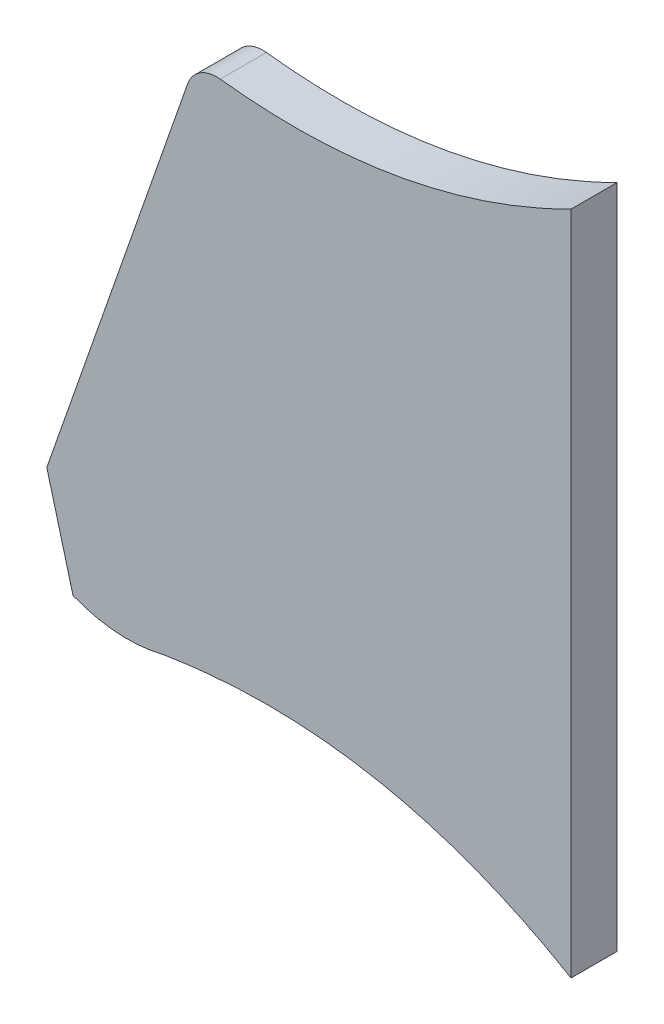
ISO-10303-21;
HEADER;
FILE_DESCRIPTION(('STEP AP214'),'2;1');
FILE_NAME('part.step','',(''),(''),'','','');
FILE_SCHEMA(('AUTOMOTIVE_DESIGN { 1 0 10303 214 1 1 1 1 }'));
ENDSEC;
DATA;
#1=APPLICATION_CONTEXT('core data for automotive mechanical design processes');
#2=APPLICATION_PROTOCOL_DEFINITION('international standard','automotive_design',2000,#1);
#3=PRODUCT_CONTEXT('',#1,'mechanical');
#4=PRODUCT('Part','Part','',(#3));
#5=PRODUCT_RELATED_PRODUCT_CATEGORY('part','',(#4));
#6=PRODUCT_DEFINITION_FORMATION('','',#4);
#7=PRODUCT_DEFINITION_CONTEXT('part definition',#1,'design');
#8=PRODUCT_DEFINITION('design','',#6,#7);
#9=PRODUCT_DEFINITION_SHAPE('','',#8);
#10=(LENGTH_UNIT() NAMED_UNIT(*) SI_UNIT(.MILLI.,.METRE.));
#11=(NAMED_UNIT(*) PLANE_ANGLE_UNIT() SI_UNIT($,.RADIAN.));
#12=(NAMED_UNIT(*) SI_UNIT($,.STERADIAN.) SOLID_ANGLE_UNIT());
#13=UNCERTAINTY_MEASURE_WITH_UNIT(LENGTH_MEASURE(1.E-05),#10,'distance_accuracy_value','');
#14=(GEOMETRIC_REPRESENTATION_CONTEXT(3) GLOBAL_UNCERTAINTY_ASSIGNED_CONTEXT((#13)) GLOBAL_UNIT_ASSIGNED_CONTEXT((#10,
#11,#12)) REPRESENTATION_CONTEXT('',''));
#15=CARTESIAN_POINT('',(0.,0.,0.));
#16=DIRECTION('',(0.,0.,1.));
#17=DIRECTION('',(1.,0.,0.));
#18=AXIS2_PLACEMENT_3D('',#15,#16,#17);
#19=CARTESIAN_POINT('',(0.,0.,3.));
#20=DIRECTION('',(0.,0.,-1.));
#21=DIRECTION('',(-1.,0.,0.));
#22=AXIS2_PLACEMENT_3D('',#19,#20,#21);
#23=PLANE('',#22);
#24=CARTESIAN_POINT('',(-5.3931093211258,31.3380293812654,3.));
#25=CARTESIAN_POINT('',(7.39537405343154,29.3584684990729,3.));
#26=CARTESIAN_POINT('',(18.997709920388,35.207268428555,3.));
#27=B_SPLINE_CURVE_WITH_KNOTS('',2,(#24,#25,#26),.UNSPECIFIED.,.F.,.F.,(3,3),(0.,1.),.UNSPECIFIED.);
#28=CARTESIAN_POINT('',(-3.81103339899508,31.1225545810064,3.));
#29=VERTEX_POINT('',#28);
#30=CARTESIAN_POINT('',(18.997709920388,35.207268428555,3.));
#31=VERTEX_POINT('',#30);
#32=EDGE_CURVE('E214',#29,#31,#27,.T.);
#33=ORIENTED_EDGE('',*,*,#32,.F.);
#34=CARTESIAN_POINT('',(-4.0444178633061,29.1362183325786,3.));
#35=DIRECTION('',(0.,0.,-1.));
#36=DIRECTION('',(-1.,0.,0.));
#37=AXIS2_PLACEMENT_3D('',#34,#35,#36);
#38=CIRCLE('',#37,2.);
#39=CARTESIAN_POINT('',(-5.93227328920437,29.7965227251934,3.));
#40=VERTEX_POINT('',#39);
#41=EDGE_CURVE('E78',#29,#40,#38,.F.);
#42=ORIENTED_EDGE('',*,*,#41,.T.);
#43=DIRECTION('',(0.330152196307426,0.943927712949134,0.));
#44=VECTOR('',#43,1.);
#45=CARTESIAN_POINT('',(-5.39310932447679,31.3380293812812,3.));
#46=LINE('',#45,#44);
#47=CARTESIAN_POINT('',(-15.0880835271317,3.61943496159888,3.));
#48=VERTEX_POINT('',#47);
#49=EDGE_CURVE('E114',#48,#40,#46,.T.);
#50=ORIENTED_EDGE('',*,*,#49,.F.);
#51=DIRECTION('',(0.259073903685408,-0.965857501099,0.));
#52=VECTOR('',#51,1.);
#53=CARTESIAN_POINT('',(-15.0880835271317,3.61943496159888,3.));
#54=LINE('',#53,#52);
#55=CARTESIAN_POINT('',(-13.3809594999607,-2.74492101364292,3.));
#56=VERTEX_POINT('',#55);
#57=EDGE_CURVE('E124',#48,#56,#54,.T.);
#58=ORIENTED_EDGE('',*,*,#57,.T.);
#59=CARTESIAN_POINT('',(-13.3809594999607,-2.74492101364292,3.));
#60=CARTESIAN_POINT('',(-10.4890091440922,-3.87702708765904,3.));
#61=CARTESIAN_POINT('',(-7.50113182563918,-3.13114999049986,3.));
#62=B_SPLINE_CURVE_WITH_KNOTS('',2,(#59,#60,#61),.UNSPECIFIED.,.F.,.F.,(3,3),(0.,1.),.UNSPECIFIED.);
#63=CARTESIAN_POINT('',(-7.50113182563918,-3.13114999049986,3.));
#64=VERTEX_POINT('',#63);
#65=EDGE_CURVE('E130',#56,#64,#62,.T.);
#66=ORIENTED_EDGE('',*,*,#65,.T.);
#67=CARTESIAN_POINT('',(18.997709920388,-8.08522382771253,3.));
#68=CARTESIAN_POINT('',(6.68721029881883,-0.804092068703304,3.));
#69=CARTESIAN_POINT('',(-7.50113182563918,-3.13114999049986,3.));
#70=B_SPLINE_CURVE_WITH_KNOTS('',2,(#67,#68,#69),.UNSPECIFIED.,.F.,.F.,(3,3),(0.,1.),.UNSPECIFIED.);
#71=CARTESIAN_POINT('',(18.997709920388,-8.08522382771253,3.));
#72=VERTEX_POINT('',#71);
#73=EDGE_CURVE('E234',#72,#64,#70,.T.);
#74=ORIENTED_EDGE('',*,*,#73,.F.);
#75=DIRECTION('',(0.,1.,0.));
#76=VECTOR('',#75,1.);
#77=CARTESIAN_POINT('',(18.997709920388,-31.6164188323789,3.));
#78=LINE('',#77,#76);
#79=EDGE_CURVE('E191',#72,#31,#78,.T.);
#80=ORIENTED_EDGE('',*,*,#79,.T.);
#81=EDGE_LOOP('',(#33,#42,#50,#58,#66,#74,#80));
#82=FACE_BOUND('',#81,.T.);
#83=ADVANCED_FACE('F56',(#82),#23,.F.);
#84=CARTESIAN_POINT('',(0.,0.,0.));
#85=DIRECTION('',(0.,0.,-1.));
#86=DIRECTION('',(-1.,0.,0.));
#87=AXIS2_PLACEMENT_3D('',#84,#85,#86);
#88=PLANE('',#87);
#89=DIRECTION('',(-0.330152196307426,-0.943927712949134,0.));
#90=VECTOR('',#89,1.);
#91=CARTESIAN_POINT('',(-14.5714353051369,5.09656756904834,0.));
#92=LINE('',#91,#90);
#93=CARTESIAN_POINT('',(-5.93227328920437,29.7965227251934,0.));
#94=VERTEX_POINT('',#93);
#95=CARTESIAN_POINT('',(-15.0880835271317,3.61943496159888,0.));
#96=VERTEX_POINT('',#95);
#97=EDGE_CURVE('E115',#94,#96,#92,.T.);
#98=ORIENTED_EDGE('',*,*,#97,.F.);
#99=CARTESIAN_POINT('',(-4.0444178633061,29.1362183325786,0.));
#100=DIRECTION('',(0.,0.,-1.));
#101=DIRECTION('',(-1.,0.,0.));
#102=AXIS2_PLACEMENT_3D('',#99,#100,#101);
#103=CIRCLE('',#102,2.);
#104=CARTESIAN_POINT('',(-3.81103339899508,31.1225545810064,0.));
#105=VERTEX_POINT('',#104);
#106=EDGE_CURVE('E12',#94,#105,#103,.T.);
#107=ORIENTED_EDGE('',*,*,#106,.T.);
#108=CARTESIAN_POINT('',(-5.3931093211258,31.3380293812654,0.));
#109=CARTESIAN_POINT('',(7.39537405343154,29.3584684990729,0.));
#110=CARTESIAN_POINT('',(18.997709920388,35.207268428555,0.));
#111=B_SPLINE_CURVE_WITH_KNOTS('',2,(#108,#109,#110),.UNSPECIFIED.,.F.,.F.,(3,3),(0.,1.),.UNSPECIFIED.);
#112=CARTESIAN_POINT('',(18.997709920388,35.207268428555,0.));
#113=VERTEX_POINT('',#112);
#114=EDGE_CURVE('E131',#113,#105,#111,.F.);
#115=ORIENTED_EDGE('',*,*,#114,.F.);
#116=DIRECTION('',(0.,1.,0.));
#117=VECTOR('',#116,1.);
#118=CARTESIAN_POINT('',(18.997709920388,-31.6164188323789,0.));
#119=LINE('',#118,#117);
#120=CARTESIAN_POINT('',(18.997709920388,-8.08522382771253,0.));
#121=VERTEX_POINT('',#120);
#122=EDGE_CURVE('E120',#121,#113,#119,.T.);
#123=ORIENTED_EDGE('',*,*,#122,.F.);
#124=CARTESIAN_POINT('',(18.997709920388,-8.08522382771253,0.));
#125=CARTESIAN_POINT('',(6.68721029881883,-0.804092068703304,0.));
#126=CARTESIAN_POINT('',(-7.50113182563918,-3.13114999049986,0.));
#127=B_SPLINE_CURVE_WITH_KNOTS('',2,(#124,#125,#126),.UNSPECIFIED.,.F.,.F.,(3,3),(0.,1.),.UNSPECIFIED.);
#128=CARTESIAN_POINT('',(-7.50113182563918,-3.13114999049986,0.));
#129=VERTEX_POINT('',#128);
#130=EDGE_CURVE('E121',#129,#121,#127,.F.);
#131=ORIENTED_EDGE('',*,*,#130,.F.);
#132=CARTESIAN_POINT('',(-13.3809594999607,-2.74492101364292,0.));
#133=CARTESIAN_POINT('',(-10.4890091440922,-3.87702708765904,0.));
#134=CARTESIAN_POINT('',(-7.50113182563918,-3.13114999049986,0.));
#135=B_SPLINE_CURVE_WITH_KNOTS('',2,(#132,#133,#134),.UNSPECIFIED.,.F.,.F.,(3,3),(0.,1.),.UNSPECIFIED.);
#136=CARTESIAN_POINT('',(-13.3809594999607,-2.74492101364292,0.));
#137=VERTEX_POINT('',#136);
#138=EDGE_CURVE('E144',#137,#129,#135,.T.);
#139=ORIENTED_EDGE('',*,*,#138,.F.);
#140=DIRECTION('',(0.259073903685408,-0.965857501099,0.));
#141=VECTOR('',#140,1.);
#142=CARTESIAN_POINT('',(-15.0880835271317,3.61943496159888,0.));
#143=LINE('',#142,#141);
#144=EDGE_CURVE('E133',#96,#137,#143,.T.);
#145=ORIENTED_EDGE('',*,*,#144,.F.);
#146=EDGE_LOOP('',(#98,#107,#115,#123,#131,#139,#145));
#147=FACE_BOUND('',#146,.T.);
#148=ADVANCED_FACE('F174',(#147),#88,.T.);
#149=CARTESIAN_POINT('',(18.997709920388,-31.6164188323789,3.));
#150=DIRECTION('',(-1.,0.,0.));
#151=DIRECTION('',(0.,-1.,0.));
#152=AXIS2_PLACEMENT_3D('',#149,#150,#151);
#153=PLANE('',#152);
#154=ORIENTED_EDGE('',*,*,#122,.T.);
#155=DIRECTION('',(0.,0.,1.));
#156=VECTOR('',#155,1.);
#157=CARTESIAN_POINT('',(18.997709920388,35.207268428555,-7.));
#158=LINE('',#157,#156);
#159=EDGE_CURVE('E136',#113,#31,#158,.T.);
#160=ORIENTED_EDGE('',*,*,#159,.T.);
#161=ORIENTED_EDGE('',*,*,#79,.F.);
#162=DIRECTION('',(0.,0.,1.));
#163=VECTOR('',#162,1.);
#164=CARTESIAN_POINT('',(18.997709920388,-8.08522382771253,-7.));
#165=LINE('',#164,#163);
#166=EDGE_CURVE('E188',#121,#72,#165,.T.);
#167=ORIENTED_EDGE('',*,*,#166,.F.);
#168=EDGE_LOOP('',(#154,#160,#161,#167));
#169=FACE_BOUND('',#168,.T.);
#170=ADVANCED_FACE('F170',(#169),#153,.F.);
#171=CARTESIAN_POINT('',(18.997709920388,-8.08522382771253,-7.));
#172=CARTESIAN_POINT('',(6.68721029881883,-0.804092068703304,-7.));
#173=CARTESIAN_POINT('',(-7.50113182563918,-3.13114999049986,-7.));
#174=B_SPLINE_CURVE_WITH_KNOTS('',2,(#171,#172,#173),.UNSPECIFIED.,.F.,.F.,(3,3),(0.,1.),.UNSPECIFIED.);
#175=DIRECTION('',(0.,0.,1.));
#176=VECTOR('',#175,1.);
#177=SURFACE_OF_LINEAR_EXTRUSION('',#174,#176);
#178=ORIENTED_EDGE('',*,*,#130,.T.);
#179=ORIENTED_EDGE('',*,*,#166,.T.);
#180=ORIENTED_EDGE('',*,*,#73,.T.);
#181=DIRECTION('',(0.,0.,1.));
#182=VECTOR('',#181,1.);
#183=CARTESIAN_POINT('',(-7.50113182563918,-3.13114999049986,-7.));
#184=LINE('',#183,#182);
#185=EDGE_CURVE('E193',#64,#129,#184,.F.);
#186=ORIENTED_EDGE('',*,*,#185,.T.);
#187=EDGE_LOOP('',(#178,#179,#180,#186));
#188=FACE_BOUND('',#187,.T.);
#189=ADVANCED_FACE('F167',(#188),#177,.F.);
#190=CARTESIAN_POINT('',(-15.0880835271317,3.61943496159888,-10.4070371953547));
#191=DIRECTION('',(-0.965857501099,-0.259073903685408,0.));
#192=DIRECTION('',(0.259073903685408,-0.965857501099,0.));
#193=AXIS2_PLACEMENT_3D('',#190,#191,#192);
#194=PLANE('',#193);
#195=DIRECTION('',(0.,0.,1.));
#196=VECTOR('',#195,1.);
#197=CARTESIAN_POINT('',(-15.0880835271317,3.61943496159888,-35.8066593166417));
#198=LINE('',#197,#196);
#199=EDGE_CURVE('E112',#96,#48,#198,.T.);
#200=ORIENTED_EDGE('',*,*,#199,.F.);
#201=ORIENTED_EDGE('',*,*,#144,.T.);
#202=DIRECTION('',(0.,0.,1.));
#203=VECTOR('',#202,1.);
#204=CARTESIAN_POINT('',(-13.3809594999607,-2.74492101364292,-10.4070371953547));
#205=LINE('',#204,#203);
#206=EDGE_CURVE('E129',#137,#56,#205,.T.);
#207=ORIENTED_EDGE('',*,*,#206,.T.);
#208=ORIENTED_EDGE('',*,*,#57,.F.);
#209=EDGE_LOOP('',(#200,#201,#207,#208));
#210=FACE_BOUND('',#209,.T.);
#211=ADVANCED_FACE('F127',(#210),#194,.T.);
#212=CARTESIAN_POINT('',(-13.3809594999607,-2.74492101364292,-10.4070371953547));
#213=CARTESIAN_POINT('',(-10.4890091440922,-3.87702708765904,-10.4070371953547));
#214=CARTESIAN_POINT('',(-7.50113182563918,-3.13114999049986,-10.4070371953547));
#215=B_SPLINE_CURVE_WITH_KNOTS('',2,(#212,#213,#214),.UNSPECIFIED.,.F.,.F.,(3,3),(0.,1.),.UNSPECIFIED.);
#216=DIRECTION('',(0.,0.,1.));
#217=VECTOR('',#216,1.);
#218=SURFACE_OF_LINEAR_EXTRUSION('',#215,#217);
#219=ORIENTED_EDGE('',*,*,#206,.F.);
#220=ORIENTED_EDGE('',*,*,#138,.T.);
#221=ORIENTED_EDGE('',*,*,#185,.F.);
#222=ORIENTED_EDGE('',*,*,#65,.F.);
#223=EDGE_LOOP('',(#219,#220,#221,#222));
#224=FACE_BOUND('',#223,.T.);
#225=ADVANCED_FACE('F157',(#224),#218,.T.);
#226=CARTESIAN_POINT('',(-5.3931093211258,31.3380293812654,-7.));
#227=CARTESIAN_POINT('',(7.39537405343154,29.3584684990729,-7.));
#228=CARTESIAN_POINT('',(18.997709920388,35.207268428555,-7.));
#229=B_SPLINE_CURVE_WITH_KNOTS('',2,(#226,#227,#228),.UNSPECIFIED.,.F.,.F.,(3,3),(0.,1.),.UNSPECIFIED.);
#230=DIRECTION('',(0.,0.,1.));
#231=VECTOR('',#230,1.);
#232=SURFACE_OF_LINEAR_EXTRUSION('',#229,#231);
#233=ORIENTED_EDGE('',*,*,#114,.T.);
#234=DIRECTION('',(0.,0.,1.));
#235=VECTOR('',#234,1.);
#236=CARTESIAN_POINT('',(-3.8110333989947,31.1225545810064,0.));
#237=LINE('',#236,#235);
#238=EDGE_CURVE('E205',#105,#29,#237,.T.);
#239=ORIENTED_EDGE('',*,*,#238,.T.);
#240=ORIENTED_EDGE('',*,*,#32,.T.);
#241=ORIENTED_EDGE('',*,*,#159,.F.);
#242=EDGE_LOOP('',(#233,#239,#240,#241));
#243=FACE_BOUND('',#242,.T.);
#244=ADVANCED_FACE('F161',(#243),#232,.F.);
#245=CARTESIAN_POINT('',(-5.39310932447679,31.3380293812812,-7.));
#246=DIRECTION('',(0.943927712949134,-0.330152196307426,0.));
#247=DIRECTION('',(0.330152196307426,0.943927712949134,0.));
#248=AXIS2_PLACEMENT_3D('',#245,#246,#247);
#249=PLANE('',#248);
#250=ORIENTED_EDGE('',*,*,#49,.T.);
#251=DIRECTION('',(0.,0.,1.));
#252=VECTOR('',#251,1.);
#253=CARTESIAN_POINT('',(-5.93227328920437,29.7965227251934,-7.));
#254=LINE('',#253,#252);
#255=EDGE_CURVE('E64',#40,#94,#254,.F.);
#256=ORIENTED_EDGE('',*,*,#255,.T.);
#257=ORIENTED_EDGE('',*,*,#97,.T.);
#258=ORIENTED_EDGE('',*,*,#199,.T.);
#259=EDGE_LOOP('',(#250,#256,#257,#258));
#260=FACE_BOUND('',#259,.T.);
#261=ADVANCED_FACE('F113',(#260),#249,.F.);
#262=CARTESIAN_POINT('',(-4.0444178633061,29.1362183325786,1.5));
#263=DIRECTION('',(0.,0.,1.));
#264=DIRECTION('',(1.,0.,0.));
#265=AXIS2_PLACEMENT_3D('',#262,#263,#264);
#266=CYLINDRICAL_SURFACE('',#265,2.);
#267=ORIENTED_EDGE('',*,*,#106,.F.);
#268=ORIENTED_EDGE('',*,*,#255,.F.);
#269=ORIENTED_EDGE('',*,*,#41,.F.);
#270=ORIENTED_EDGE('',*,*,#238,.F.);
#271=EDGE_LOOP('',(#267,#268,#269,#270));
#272=FACE_BOUND('',#271,.T.);
#273=ADVANCED_FACE('F58',(#272),#266,.T.);
#274=CLOSED_SHELL('',(#83,#148,#170,#189,#211,#225,#244,#261,#273));
#275=MANIFOLD_SOLID_BREP('B2',#274);
#276=ADVANCED_BREP_SHAPE_REPRESENTATION('',(#18,#275),#14);
#277=SHAPE_DEFINITION_REPRESENTATION(#9,#276);
ENDSEC;
END-ISO-10303-21;
